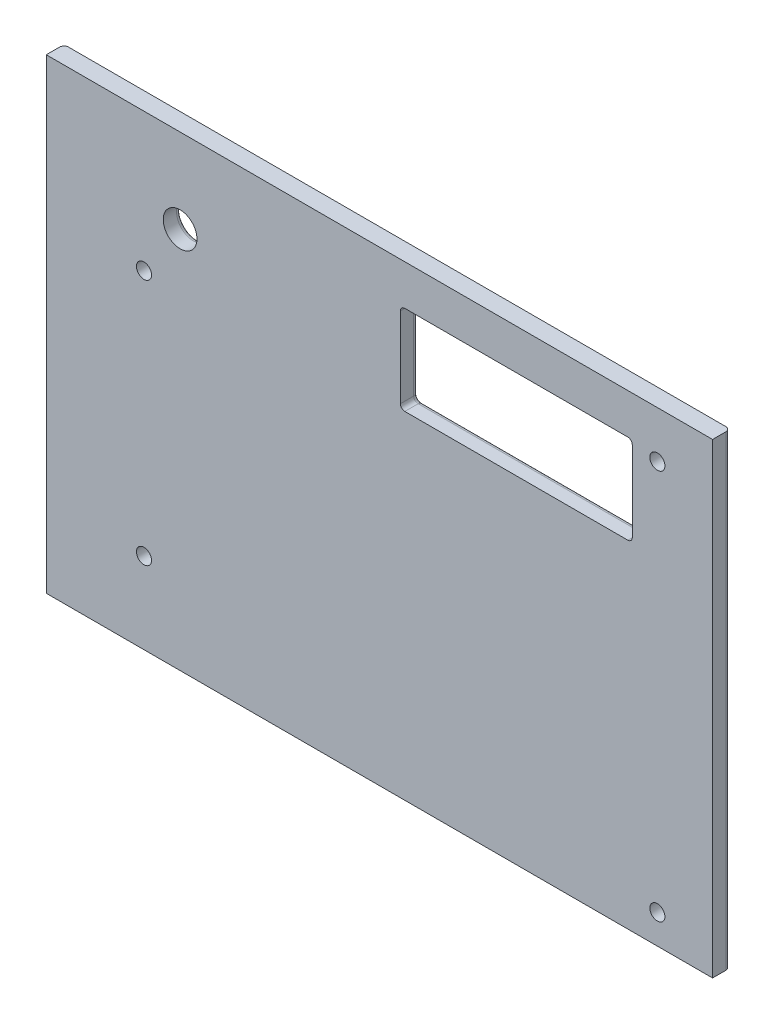
ISO-10303-21;
HEADER;
FILE_DESCRIPTION(('STEP AP214'),'2;1');
FILE_NAME('part.step','',(''),(''),'','','');
FILE_SCHEMA(('AUTOMOTIVE_DESIGN { 1 0 10303 214 1 1 1 1 }'));
ENDSEC;
DATA;
#1=APPLICATION_CONTEXT('core data for automotive mechanical design processes');
#2=APPLICATION_PROTOCOL_DEFINITION('international standard','automotive_design',2000,#1);
#3=PRODUCT_CONTEXT('',#1,'mechanical');
#4=PRODUCT('Part','Part','',(#3));
#5=PRODUCT_RELATED_PRODUCT_CATEGORY('part','',(#4));
#6=PRODUCT_DEFINITION_FORMATION('','',#4);
#7=PRODUCT_DEFINITION_CONTEXT('part definition',#1,'design');
#8=PRODUCT_DEFINITION('design','',#6,#7);
#9=PRODUCT_DEFINITION_SHAPE('','',#8);
#10=(LENGTH_UNIT() NAMED_UNIT(*) SI_UNIT(.MILLI.,.METRE.));
#11=(NAMED_UNIT(*) PLANE_ANGLE_UNIT() SI_UNIT($,.RADIAN.));
#12=(NAMED_UNIT(*) SI_UNIT($,.STERADIAN.) SOLID_ANGLE_UNIT());
#13=UNCERTAINTY_MEASURE_WITH_UNIT(LENGTH_MEASURE(1.E-05),#10,'distance_accuracy_value','');
#14=(GEOMETRIC_REPRESENTATION_CONTEXT(3) GLOBAL_UNCERTAINTY_ASSIGNED_CONTEXT((#13)) GLOBAL_UNIT_ASSIGNED_CONTEXT((#10,
#11,#12)) REPRESENTATION_CONTEXT('',''));
#15=CARTESIAN_POINT('',(0.,0.,0.));
#16=DIRECTION('',(0.,0.,1.));
#17=DIRECTION('',(1.,0.,0.));
#18=AXIS2_PLACEMENT_3D('',#15,#16,#17);
#19=CARTESIAN_POINT('',(0.,0.,-2.));
#20=DIRECTION('',(0.,0.,-1.));
#21=DIRECTION('',(-1.,0.,0.));
#22=AXIS2_PLACEMENT_3D('',#19,#20,#21);
#23=PLANE('',#22);
#24=CARTESIAN_POINT('',(-44.87,33.54,-2.));
#25=DIRECTION('',(0.,0.,-1.));
#26=DIRECTION('',(-1.,0.,0.));
#27=AXIS2_PLACEMENT_3D('',#24,#25,#26);
#28=CIRCLE('',#27,4.8);
#29=CARTESIAN_POINT('',(-49.67,33.54,-2.));
#30=VERTEX_POINT('',#29);
#31=EDGE_CURVE('E251',#30,#30,#28,.F.);
#32=ORIENTED_EDGE('',*,*,#31,.T.);
#33=EDGE_LOOP('',(#32));
#34=FACE_BOUND('',#33,.T.);
#35=DIRECTION('',(1.,0.,0.));
#36=VECTOR('',#35,1.);
#37=CARTESIAN_POINT('',(75.,-52.5,-2.));
#38=LINE('',#37,#36);
#39=CARTESIAN_POINT('',(-74.,-52.5,-2.));
#40=VERTEX_POINT('',#39);
#41=CARTESIAN_POINT('',(74.,-52.5,-2.));
#42=VERTEX_POINT('',#41);
#43=EDGE_CURVE('E308',#40,#42,#38,.T.);
#44=ORIENTED_EDGE('',*,*,#43,.F.);
#45=DIRECTION('',(0.,-1.,0.));
#46=VECTOR('',#45,1.);
#47=CARTESIAN_POINT('',(-74.,52.5,-2.));
#48=LINE('',#47,#46);
#49=CARTESIAN_POINT('',(-74.,52.5,-2.));
#50=VERTEX_POINT('',#49);
#51=EDGE_CURVE('E61',#40,#50,#48,.F.);
#52=ORIENTED_EDGE('',*,*,#51,.T.);
#53=DIRECTION('',(-1.,0.,0.));
#54=VECTOR('',#53,1.);
#55=CARTESIAN_POINT('',(75.,52.5,-2.));
#56=LINE('',#55,#54);
#57=CARTESIAN_POINT('',(74.,52.5,-2.));
#58=VERTEX_POINT('',#57);
#59=EDGE_CURVE('E186',#58,#50,#56,.T.);
#60=ORIENTED_EDGE('',*,*,#59,.F.);
#61=DIRECTION('',(0.,1.,0.));
#62=VECTOR('',#61,1.);
#63=CARTESIAN_POINT('',(74.,-52.5,-2.));
#64=LINE('',#63,#62);
#65=EDGE_CURVE('E297',#58,#42,#64,.F.);
#66=ORIENTED_EDGE('',*,*,#65,.T.);
#67=EDGE_LOOP('',(#44,#52,#60,#66));
#68=FACE_BOUND('',#67,.T.);
#69=CARTESIAN_POINT('',(62.57,41.97,-2.));
#70=DIRECTION('',(0.,0.,1.));
#71=DIRECTION('',(1.,0.,0.));
#72=AXIS2_PLACEMENT_3D('',#69,#70,#71);
#73=CIRCLE('',#72,3.3);
#74=CARTESIAN_POINT('',(65.87,41.97,-2.));
#75=VERTEX_POINT('',#74);
#76=EDGE_CURVE('E447',#75,#75,#73,.T.);
#77=ORIENTED_EDGE('',*,*,#76,.T.);
#78=EDGE_LOOP('',(#77));
#79=FACE_BOUND('',#78,.T.);
#80=CARTESIAN_POINT('',(62.57,-45.91,-2.));
#81=DIRECTION('',(0.,0.,1.));
#82=DIRECTION('',(1.,0.,0.));
#83=AXIS2_PLACEMENT_3D('',#80,#81,#82);
#84=CIRCLE('',#83,3.3);
#85=CARTESIAN_POINT('',(65.87,-45.91,-2.));
#86=VERTEX_POINT('',#85);
#87=EDGE_CURVE('E438',#86,#86,#84,.T.);
#88=ORIENTED_EDGE('',*,*,#87,.T.);
#89=EDGE_LOOP('',(#88));
#90=FACE_BOUND('',#89,.T.);
#91=CARTESIAN_POINT('',(-53.,-34.23,-2.));
#92=DIRECTION('',(0.,0.,1.));
#93=DIRECTION('',(1.,0.,0.));
#94=AXIS2_PLACEMENT_3D('',#91,#92,#93);
#95=CIRCLE('',#94,3.3);
#96=CARTESIAN_POINT('',(-49.7,-34.23,-2.));
#97=VERTEX_POINT('',#96);
#98=EDGE_CURVE('E429',#97,#97,#95,.T.);
#99=ORIENTED_EDGE('',*,*,#98,.T.);
#100=EDGE_LOOP('',(#99));
#101=FACE_BOUND('',#100,.T.);
#102=CARTESIAN_POINT('',(-53.,21.4,-2.));
#103=DIRECTION('',(0.,0.,1.));
#104=DIRECTION('',(1.,0.,0.));
#105=AXIS2_PLACEMENT_3D('',#102,#103,#104);
#106=CIRCLE('',#105,3.3);
#107=CARTESIAN_POINT('',(-49.7,21.4,-2.));
#108=VERTEX_POINT('',#107);
#109=EDGE_CURVE('E413',#108,#108,#106,.T.);
#110=ORIENTED_EDGE('',*,*,#109,.T.);
#111=EDGE_LOOP('',(#110));
#112=FACE_BOUND('',#111,.T.);
#113=CARTESIAN_POINT('',(5.71999999999998,42.42,-2.));
#114=DIRECTION('',(0.,0.,-1.));
#115=DIRECTION('',(-1.,0.,0.));
#116=AXIS2_PLACEMENT_3D('',#113,#114,#115);
#117=CIRCLE('',#116,2.);
#118=CARTESIAN_POINT('',(3.71999999999998,42.42,-2.));
#119=VERTEX_POINT('',#118);
#120=CARTESIAN_POINT('',(5.71999999999998,44.42,-2.));
#121=VERTEX_POINT('',#120);
#122=EDGE_CURVE('E222',#119,#121,#117,.T.);
#123=ORIENTED_EDGE('',*,*,#122,.F.);
#124=DIRECTION('',(0.,1.,0.));
#125=VECTOR('',#124,1.);
#126=CARTESIAN_POINT('',(3.71999999999998,23.32,-2.));
#127=LINE('',#126,#125);
#128=CARTESIAN_POINT('',(3.71999999999998,24.32,-2.));
#129=VERTEX_POINT('',#128);
#130=EDGE_CURVE('E219',#119,#129,#127,.F.);
#131=ORIENTED_EDGE('',*,*,#130,.T.);
#132=CARTESIAN_POINT('',(5.71999999999998,24.32,-2.));
#133=DIRECTION('',(0.,0.,-1.));
#134=DIRECTION('',(-1.,0.,0.));
#135=AXIS2_PLACEMENT_3D('',#132,#133,#134);
#136=CIRCLE('',#135,2.);
#137=CARTESIAN_POINT('',(5.71999999999998,22.32,-2.));
#138=VERTEX_POINT('',#137);
#139=EDGE_CURVE('E216',#138,#129,#136,.T.);
#140=ORIENTED_EDGE('',*,*,#139,.F.);
#141=DIRECTION('',(1.,0.,0.));
#142=VECTOR('',#141,1.);
#143=CARTESIAN_POINT('',(0.,22.32,-2.));
#144=LINE('',#143,#142);
#145=CARTESIAN_POINT('',(55.92,22.32,-2.));
#146=VERTEX_POINT('',#145);
#147=EDGE_CURVE('E214',#138,#146,#144,.T.);
#148=ORIENTED_EDGE('',*,*,#147,.T.);
#149=CARTESIAN_POINT('',(55.92,24.32,-2.));
#150=DIRECTION('',(0.,0.,-1.));
#151=DIRECTION('',(-1.,0.,0.));
#152=AXIS2_PLACEMENT_3D('',#149,#150,#151);
#153=CIRCLE('',#152,2.);
#154=CARTESIAN_POINT('',(57.92,24.32,-2.));
#155=VERTEX_POINT('',#154);
#156=EDGE_CURVE('E211',#155,#146,#153,.T.);
#157=ORIENTED_EDGE('',*,*,#156,.F.);
#158=DIRECTION('',(0.,1.,0.));
#159=VECTOR('',#158,1.);
#160=CARTESIAN_POINT('',(57.92,0.,-2.));
#161=LINE('',#160,#159);
#162=CARTESIAN_POINT('',(57.92,42.42,-2.));
#163=VERTEX_POINT('',#162);
#164=EDGE_CURVE('E207',#155,#163,#161,.T.);
#165=ORIENTED_EDGE('',*,*,#164,.T.);
#166=CARTESIAN_POINT('',(55.92,42.42,-2.));
#167=DIRECTION('',(0.,0.,-1.));
#168=DIRECTION('',(-1.,0.,0.));
#169=AXIS2_PLACEMENT_3D('',#166,#167,#168);
#170=CIRCLE('',#169,2.);
#171=CARTESIAN_POINT('',(55.92,44.42,-2.));
#172=VERTEX_POINT('',#171);
#173=EDGE_CURVE('E204',#172,#163,#170,.T.);
#174=ORIENTED_EDGE('',*,*,#173,.F.);
#175=DIRECTION('',(1.,0.,0.));
#176=VECTOR('',#175,1.);
#177=CARTESIAN_POINT('',(4.71999999999998,44.42,-2.));
#178=LINE('',#177,#176);
#179=EDGE_CURVE('E209',#172,#121,#178,.F.);
#180=ORIENTED_EDGE('',*,*,#179,.T.);
#181=EDGE_LOOP('',(#123,#131,#140,#148,#157,#165,#174,#180));
#182=FACE_BOUND('',#181,.T.);
#183=ADVANCED_FACE('F39',(#34,#68,#79,#90,#101,#112,#182),#23,.T.);
#184=CARTESIAN_POINT('',(0.,0.,2.));
#185=DIRECTION('',(0.,0.,-1.));
#186=DIRECTION('',(-1.,0.,0.));
#187=AXIS2_PLACEMENT_3D('',#184,#185,#186);
#188=PLANE('',#187);
#189=DIRECTION('',(0.,-1.,0.));
#190=VECTOR('',#189,1.);
#191=CARTESIAN_POINT('',(-75.,52.5,2.));
#192=LINE('',#191,#190);
#193=CARTESIAN_POINT('',(-75.,52.5,2.));
#194=VERTEX_POINT('',#193);
#195=CARTESIAN_POINT('',(-75.,-52.5,2.));
#196=VERTEX_POINT('',#195);
#197=EDGE_CURVE('E176',#194,#196,#192,.T.);
#198=ORIENTED_EDGE('',*,*,#197,.T.);
#199=DIRECTION('',(1.,0.,0.));
#200=VECTOR('',#199,1.);
#201=CARTESIAN_POINT('',(75.,-52.5,2.));
#202=LINE('',#201,#200);
#203=CARTESIAN_POINT('',(75.,-52.5,2.));
#204=VERTEX_POINT('',#203);
#205=EDGE_CURVE('E166',#196,#204,#202,.T.);
#206=ORIENTED_EDGE('',*,*,#205,.T.);
#207=DIRECTION('',(0.,1.,0.));
#208=VECTOR('',#207,1.);
#209=CARTESIAN_POINT('',(75.,52.5,2.));
#210=LINE('',#209,#208);
#211=CARTESIAN_POINT('',(75.,52.5,2.));
#212=VERTEX_POINT('',#211);
#213=EDGE_CURVE('E175',#204,#212,#210,.T.);
#214=ORIENTED_EDGE('',*,*,#213,.T.);
#215=DIRECTION('',(-1.,0.,0.));
#216=VECTOR('',#215,1.);
#217=CARTESIAN_POINT('',(75.,52.5,2.));
#218=LINE('',#217,#216);
#219=EDGE_CURVE('E182',#212,#194,#218,.T.);
#220=ORIENTED_EDGE('',*,*,#219,.T.);
#221=EDGE_LOOP('',(#198,#206,#214,#220));
#222=FACE_BOUND('',#221,.T.);
#223=CARTESIAN_POINT('',(62.57,41.97,2.));
#224=DIRECTION('',(0.,0.,1.));
#225=DIRECTION('',(1.,0.,0.));
#226=AXIS2_PLACEMENT_3D('',#223,#224,#225);
#227=CIRCLE('',#226,1.69999999999999);
#228=CARTESIAN_POINT('',(64.27,41.97,2.));
#229=VERTEX_POINT('',#228);
#230=EDGE_CURVE('E315',#229,#229,#227,.T.);
#231=ORIENTED_EDGE('',*,*,#230,.F.);
#232=EDGE_LOOP('',(#231));
#233=FACE_BOUND('',#232,.T.);
#234=CARTESIAN_POINT('',(62.57,-45.91,2.));
#235=DIRECTION('',(0.,0.,1.));
#236=DIRECTION('',(1.,0.,0.));
#237=AXIS2_PLACEMENT_3D('',#234,#235,#236);
#238=CIRCLE('',#237,1.69999999999999);
#239=CARTESIAN_POINT('',(64.27,-45.91,2.));
#240=VERTEX_POINT('',#239);
#241=EDGE_CURVE('E441',#240,#240,#238,.T.);
#242=ORIENTED_EDGE('',*,*,#241,.F.);
#243=EDGE_LOOP('',(#242));
#244=FACE_BOUND('',#243,.T.);
#245=CARTESIAN_POINT('',(-53.,-34.23,2.));
#246=DIRECTION('',(0.,0.,1.));
#247=DIRECTION('',(1.,0.,0.));
#248=AXIS2_PLACEMENT_3D('',#245,#246,#247);
#249=CIRCLE('',#248,1.7);
#250=CARTESIAN_POINT('',(-51.3,-34.23,2.));
#251=VERTEX_POINT('',#250);
#252=EDGE_CURVE('E432',#251,#251,#249,.T.);
#253=ORIENTED_EDGE('',*,*,#252,.F.);
#254=EDGE_LOOP('',(#253));
#255=FACE_BOUND('',#254,.T.);
#256=CARTESIAN_POINT('',(-53.,21.4,2.));
#257=DIRECTION('',(0.,0.,1.));
#258=DIRECTION('',(1.,0.,0.));
#259=AXIS2_PLACEMENT_3D('',#256,#257,#258);
#260=CIRCLE('',#259,1.7);
#261=CARTESIAN_POINT('',(-51.3,21.4,2.));
#262=VERTEX_POINT('',#261);
#263=EDGE_CURVE('E417',#262,#262,#260,.T.);
#264=ORIENTED_EDGE('',*,*,#263,.F.);
#265=EDGE_LOOP('',(#264));
#266=FACE_BOUND('',#265,.T.);
#267=CARTESIAN_POINT('',(-44.87,33.54,2.));
#268=DIRECTION('',(0.,0.,1.));
#269=DIRECTION('',(1.,0.,0.));
#270=AXIS2_PLACEMENT_3D('',#267,#268,#269);
#271=CIRCLE('',#270,3.8);
#272=CARTESIAN_POINT('',(-41.07,33.54,2.));
#273=VERTEX_POINT('',#272);
#274=EDGE_CURVE('E411',#273,#273,#271,.T.);
#275=ORIENTED_EDGE('',*,*,#274,.F.);
#276=EDGE_LOOP('',(#275));
#277=FACE_BOUND('',#276,.T.);
#278=DIRECTION('',(0.,-1.,0.));
#279=VECTOR('',#278,1.);
#280=CARTESIAN_POINT('',(56.92,43.42,2.));
#281=LINE('',#280,#279);
#282=CARTESIAN_POINT('',(56.92,42.42,2.));
#283=VERTEX_POINT('',#282);
#284=CARTESIAN_POINT('',(56.92,24.32,2.));
#285=VERTEX_POINT('',#284);
#286=EDGE_CURVE('E414',#283,#285,#281,.T.);
#287=ORIENTED_EDGE('',*,*,#286,.T.);
#288=CARTESIAN_POINT('',(55.92,24.32,2.));
#289=DIRECTION('',(0.,0.,-1.));
#290=DIRECTION('',(-1.,0.,0.));
#291=AXIS2_PLACEMENT_3D('',#288,#289,#290);
#292=CIRCLE('',#291,1.);
#293=CARTESIAN_POINT('',(55.92,23.32,2.));
#294=VERTEX_POINT('',#293);
#295=EDGE_CURVE('E243',#285,#294,#292,.T.);
#296=ORIENTED_EDGE('',*,*,#295,.T.);
#297=DIRECTION('',(-1.,0.,0.));
#298=VECTOR('',#297,1.);
#299=CARTESIAN_POINT('',(56.92,23.32,2.));
#300=LINE('',#299,#298);
#301=CARTESIAN_POINT('',(5.71999999999998,23.32,2.));
#302=VERTEX_POINT('',#301);
#303=EDGE_CURVE('E286',#294,#302,#300,.T.);
#304=ORIENTED_EDGE('',*,*,#303,.T.);
#305=CARTESIAN_POINT('',(5.71999999999998,24.32,2.));
#306=DIRECTION('',(0.,0.,-1.));
#307=DIRECTION('',(-1.,0.,0.));
#308=AXIS2_PLACEMENT_3D('',#305,#306,#307);
#309=CIRCLE('',#308,1.);
#310=CARTESIAN_POINT('',(4.71999999999998,24.32,2.));
#311=VERTEX_POINT('',#310);
#312=EDGE_CURVE('E245',#302,#311,#309,.T.);
#313=ORIENTED_EDGE('',*,*,#312,.T.);
#314=DIRECTION('',(0.,-1.,0.));
#315=VECTOR('',#314,1.);
#316=CARTESIAN_POINT('',(4.71999999999998,43.42,2.));
#317=LINE('',#316,#315);
#318=CARTESIAN_POINT('',(4.71999999999998,42.42,2.));
#319=VERTEX_POINT('',#318);
#320=EDGE_CURVE('E478',#319,#311,#317,.T.);
#321=ORIENTED_EDGE('',*,*,#320,.F.);
#322=CARTESIAN_POINT('',(5.71999999999998,42.42,2.));
#323=DIRECTION('',(0.,0.,-1.));
#324=DIRECTION('',(-1.,0.,0.));
#325=AXIS2_PLACEMENT_3D('',#322,#323,#324);
#326=CIRCLE('',#325,1.);
#327=CARTESIAN_POINT('',(5.71999999999998,43.42,2.));
#328=VERTEX_POINT('',#327);
#329=EDGE_CURVE('E249',#319,#328,#326,.T.);
#330=ORIENTED_EDGE('',*,*,#329,.T.);
#331=DIRECTION('',(-1.,0.,0.));
#332=VECTOR('',#331,1.);
#333=CARTESIAN_POINT('',(56.92,43.42,2.));
#334=LINE('',#333,#332);
#335=CARTESIAN_POINT('',(55.92,43.42,2.));
#336=VERTEX_POINT('',#335);
#337=EDGE_CURVE('E420',#336,#328,#334,.T.);
#338=ORIENTED_EDGE('',*,*,#337,.F.);
#339=CARTESIAN_POINT('',(55.92,42.42,2.));
#340=DIRECTION('',(0.,0.,-1.));
#341=DIRECTION('',(-1.,0.,0.));
#342=AXIS2_PLACEMENT_3D('',#339,#340,#341);
#343=CIRCLE('',#342,1.);
#344=EDGE_CURVE('E247',#336,#283,#343,.T.);
#345=ORIENTED_EDGE('',*,*,#344,.T.);
#346=EDGE_LOOP('',(#287,#296,#304,#313,#321,#330,#338,#345));
#347=FACE_BOUND('',#346,.T.);
#348=ADVANCED_FACE('F179',(#222,#233,#244,#255,#266,#277,#347),#188,.F.);
#349=CARTESIAN_POINT('',(-75.,52.5,2.));
#350=DIRECTION('',(1.,0.,0.));
#351=DIRECTION('',(0.,1.,0.));
#352=AXIS2_PLACEMENT_3D('',#349,#350,#351);
#353=PLANE('',#352);
#354=DIRECTION('',(0.,0.,-1.));
#355=VECTOR('',#354,1.);
#356=CARTESIAN_POINT('',(-75.,52.5,2.));
#357=LINE('',#356,#355);
#358=CARTESIAN_POINT('',(-75.,52.5,-1.));
#359=VERTEX_POINT('',#358);
#360=EDGE_CURVE('E303',#194,#359,#357,.T.);
#361=ORIENTED_EDGE('',*,*,#360,.T.);
#362=DIRECTION('',(0.,-1.,0.));
#363=VECTOR('',#362,1.);
#364=CARTESIAN_POINT('',(-75.,-52.5,-1.));
#365=LINE('',#364,#363);
#366=CARTESIAN_POINT('',(-75.,-52.5,-1.));
#367=VERTEX_POINT('',#366);
#368=EDGE_CURVE('E191',#359,#367,#365,.T.);
#369=ORIENTED_EDGE('',*,*,#368,.T.);
#370=DIRECTION('',(0.,0.,-1.));
#371=VECTOR('',#370,1.);
#372=CARTESIAN_POINT('',(-75.,-52.5,2.));
#373=LINE('',#372,#371);
#374=EDGE_CURVE('E170',#196,#367,#373,.T.);
#375=ORIENTED_EDGE('',*,*,#374,.F.);
#376=ORIENTED_EDGE('',*,*,#197,.F.);
#377=EDGE_LOOP('',(#361,#369,#375,#376));
#378=FACE_BOUND('',#377,.T.);
#379=ADVANCED_FACE('F189',(#378),#353,.F.);
#380=CARTESIAN_POINT('',(75.,-52.5,2.));
#381=DIRECTION('',(0.,1.,0.));
#382=DIRECTION('',(-1.,0.,0.));
#383=AXIS2_PLACEMENT_3D('',#380,#381,#382);
#384=PLANE('',#383);
#385=ORIENTED_EDGE('',*,*,#374,.T.);
#386=CARTESIAN_POINT('',(-74.,-52.5,-1.));
#387=DIRECTION('',(0.,1.,0.));
#388=DIRECTION('',(-1.,0.,0.));
#389=AXIS2_PLACEMENT_3D('',#386,#387,#388);
#390=CIRCLE('',#389,1.);
#391=EDGE_CURVE('E295',#367,#40,#390,.F.);
#392=ORIENTED_EDGE('',*,*,#391,.T.);
#393=ORIENTED_EDGE('',*,*,#43,.T.);
#394=CARTESIAN_POINT('',(74.,-52.5,-1.));
#395=DIRECTION('',(0.,1.,0.));
#396=DIRECTION('',(-1.,0.,0.));
#397=AXIS2_PLACEMENT_3D('',#394,#395,#396);
#398=CIRCLE('',#397,1.);
#399=CARTESIAN_POINT('',(75.,-52.5,-1.));
#400=VERTEX_POINT('',#399);
#401=EDGE_CURVE('E293',#42,#400,#398,.F.);
#402=ORIENTED_EDGE('',*,*,#401,.T.);
#403=DIRECTION('',(0.,0.,-1.));
#404=VECTOR('',#403,1.);
#405=CARTESIAN_POINT('',(75.,-52.5,2.));
#406=LINE('',#405,#404);
#407=EDGE_CURVE('E172',#204,#400,#406,.T.);
#408=ORIENTED_EDGE('',*,*,#407,.F.);
#409=ORIENTED_EDGE('',*,*,#205,.F.);
#410=EDGE_LOOP('',(#385,#392,#393,#402,#408,#409));
#411=FACE_BOUND('',#410,.T.);
#412=ADVANCED_FACE('F168',(#411),#384,.F.);
#413=CARTESIAN_POINT('',(75.,52.5,2.));
#414=DIRECTION('',(-1.,0.,0.));
#415=DIRECTION('',(0.,-1.,0.));
#416=AXIS2_PLACEMENT_3D('',#413,#414,#415);
#417=PLANE('',#416);
#418=ORIENTED_EDGE('',*,*,#407,.T.);
#419=DIRECTION('',(0.,1.,0.));
#420=VECTOR('',#419,1.);
#421=CARTESIAN_POINT('',(75.,52.5,-1.));
#422=LINE('',#421,#420);
#423=CARTESIAN_POINT('',(75.,52.5,-1.));
#424=VERTEX_POINT('',#423);
#425=EDGE_CURVE('E11',#400,#424,#422,.T.);
#426=ORIENTED_EDGE('',*,*,#425,.T.);
#427=DIRECTION('',(0.,0.,-1.));
#428=VECTOR('',#427,1.);
#429=CARTESIAN_POINT('',(75.,52.5,2.));
#430=LINE('',#429,#428);
#431=EDGE_CURVE('E196',#212,#424,#430,.T.);
#432=ORIENTED_EDGE('',*,*,#431,.F.);
#433=ORIENTED_EDGE('',*,*,#213,.F.);
#434=EDGE_LOOP('',(#418,#426,#432,#433));
#435=FACE_BOUND('',#434,.T.);
#436=ADVANCED_FACE('F322',(#435),#417,.F.);
#437=CARTESIAN_POINT('',(75.,52.5,2.));
#438=DIRECTION('',(0.,-1.,0.));
#439=DIRECTION('',(1.,0.,0.));
#440=AXIS2_PLACEMENT_3D('',#437,#438,#439);
#441=PLANE('',#440);
#442=ORIENTED_EDGE('',*,*,#59,.T.);
#443=CARTESIAN_POINT('',(-74.,52.5,-1.));
#444=DIRECTION('',(0.,-1.,0.));
#445=DIRECTION('',(1.,0.,0.));
#446=AXIS2_PLACEMENT_3D('',#443,#444,#445);
#447=CIRCLE('',#446,1.);
#448=EDGE_CURVE('E47',#50,#359,#447,.F.);
#449=ORIENTED_EDGE('',*,*,#448,.T.);
#450=ORIENTED_EDGE('',*,*,#360,.F.);
#451=ORIENTED_EDGE('',*,*,#219,.F.);
#452=ORIENTED_EDGE('',*,*,#431,.T.);
#453=CARTESIAN_POINT('',(74.,52.5,-1.));
#454=DIRECTION('',(0.,-1.,0.));
#455=DIRECTION('',(1.,0.,0.));
#456=AXIS2_PLACEMENT_3D('',#453,#454,#455);
#457=CIRCLE('',#456,1.);
#458=EDGE_CURVE('E54',#424,#58,#457,.F.);
#459=ORIENTED_EDGE('',*,*,#458,.T.);
#460=EDGE_LOOP('',(#442,#449,#450,#451,#452,#459));
#461=FACE_BOUND('',#460,.T.);
#462=ADVANCED_FACE('F302',(#461),#441,.F.);
#463=CARTESIAN_POINT('',(62.57,41.97,-0.399999999999999));
#464=DIRECTION('',(0.,0.,-1.));
#465=DIRECTION('',(-1.,0.,0.));
#466=AXIS2_PLACEMENT_3D('',#463,#464,#465);
#467=CONICAL_SURFACE('',#466,1.69999999999999,0.785398163397449);
#468=ORIENTED_EDGE('',*,*,#76,.F.);
#469=EDGE_LOOP('',(#468));
#470=FACE_BOUND('',#469,.T.);
#471=CARTESIAN_POINT('',(62.57,41.97,-0.399999999999999));
#472=DIRECTION('',(0.,0.,1.));
#473=DIRECTION('',(1.,0.,0.));
#474=AXIS2_PLACEMENT_3D('',#471,#472,#473);
#475=CIRCLE('',#474,1.69999999999999);
#476=CARTESIAN_POINT('',(64.27,41.97,-0.399999999999999));
#477=VERTEX_POINT('',#476);
#478=EDGE_CURVE('E311',#477,#477,#475,.T.);
#479=ORIENTED_EDGE('',*,*,#478,.T.);
#480=EDGE_LOOP('',(#479));
#481=FACE_BOUND('',#480,.T.);
#482=ADVANCED_FACE('F341',(#470,#481),#467,.F.);
#483=CARTESIAN_POINT('',(62.57,41.97,2.));
#484=DIRECTION('',(0.,0.,1.));
#485=DIRECTION('',(1.,0.,0.));
#486=AXIS2_PLACEMENT_3D('',#483,#484,#485);
#487=CYLINDRICAL_SURFACE('',#486,1.69999999999999);
#488=ORIENTED_EDGE('',*,*,#478,.F.);
#489=EDGE_LOOP('',(#488));
#490=FACE_BOUND('',#489,.T.);
#491=ORIENTED_EDGE('',*,*,#230,.T.);
#492=EDGE_LOOP('',(#491));
#493=FACE_BOUND('',#492,.T.);
#494=ADVANCED_FACE('F453',(#490,#493),#487,.F.);
#495=CARTESIAN_POINT('',(62.57,-45.91,-0.399999999999999));
#496=DIRECTION('',(0.,0.,-1.));
#497=DIRECTION('',(-1.,0.,0.));
#498=AXIS2_PLACEMENT_3D('',#495,#496,#497);
#499=CONICAL_SURFACE('',#498,1.69999999999999,0.785398163397449);
#500=ORIENTED_EDGE('',*,*,#87,.F.);
#501=EDGE_LOOP('',(#500));
#502=FACE_BOUND('',#501,.T.);
#503=CARTESIAN_POINT('',(62.57,-45.91,-0.399999999999999));
#504=DIRECTION('',(0.,0.,1.));
#505=DIRECTION('',(1.,0.,0.));
#506=AXIS2_PLACEMENT_3D('',#503,#504,#505);
#507=CIRCLE('',#506,1.69999999999999);
#508=CARTESIAN_POINT('',(64.27,-45.91,-0.399999999999999));
#509=VERTEX_POINT('',#508);
#510=EDGE_CURVE('E444',#509,#509,#507,.T.);
#511=ORIENTED_EDGE('',*,*,#510,.T.);
#512=EDGE_LOOP('',(#511));
#513=FACE_BOUND('',#512,.T.);
#514=ADVANCED_FACE('F530',(#502,#513),#499,.F.);
#515=CARTESIAN_POINT('',(62.57,-45.91,2.));
#516=DIRECTION('',(0.,0.,1.));
#517=DIRECTION('',(1.,0.,0.));
#518=AXIS2_PLACEMENT_3D('',#515,#516,#517);
#519=CYLINDRICAL_SURFACE('',#518,1.69999999999999);
#520=ORIENTED_EDGE('',*,*,#510,.F.);
#521=EDGE_LOOP('',(#520));
#522=FACE_BOUND('',#521,.T.);
#523=ORIENTED_EDGE('',*,*,#241,.T.);
#524=EDGE_LOOP('',(#523));
#525=FACE_BOUND('',#524,.T.);
#526=ADVANCED_FACE('F526',(#522,#525),#519,.F.);
#527=CARTESIAN_POINT('',(-53.,-34.23,-0.399999999999999));
#528=DIRECTION('',(0.,0.,-1.));
#529=DIRECTION('',(-1.,0.,0.));
#530=AXIS2_PLACEMENT_3D('',#527,#528,#529);
#531=CONICAL_SURFACE('',#530,1.7,0.785398163397447);
#532=ORIENTED_EDGE('',*,*,#98,.F.);
#533=EDGE_LOOP('',(#532));
#534=FACE_BOUND('',#533,.T.);
#535=CARTESIAN_POINT('',(-53.,-34.23,-0.399999999999999));
#536=DIRECTION('',(0.,0.,1.));
#537=DIRECTION('',(1.,0.,0.));
#538=AXIS2_PLACEMENT_3D('',#535,#536,#537);
#539=CIRCLE('',#538,1.7);
#540=CARTESIAN_POINT('',(-51.3,-34.23,-0.399999999999999));
#541=VERTEX_POINT('',#540);
#542=EDGE_CURVE('E435',#541,#541,#539,.T.);
#543=ORIENTED_EDGE('',*,*,#542,.T.);
#544=EDGE_LOOP('',(#543));
#545=FACE_BOUND('',#544,.T.);
#546=ADVANCED_FACE('F522',(#534,#545),#531,.F.);
#547=CARTESIAN_POINT('',(-53.,-34.23,2.));
#548=DIRECTION('',(0.,0.,1.));
#549=DIRECTION('',(1.,0.,0.));
#550=AXIS2_PLACEMENT_3D('',#547,#548,#549);
#551=CYLINDRICAL_SURFACE('',#550,1.7);
#552=ORIENTED_EDGE('',*,*,#542,.F.);
#553=EDGE_LOOP('',(#552));
#554=FACE_BOUND('',#553,.T.);
#555=ORIENTED_EDGE('',*,*,#252,.T.);
#556=EDGE_LOOP('',(#555));
#557=FACE_BOUND('',#556,.T.);
#558=ADVANCED_FACE('F518',(#554,#557),#551,.F.);
#559=CARTESIAN_POINT('',(-53.,21.4,-0.399999999999999));
#560=DIRECTION('',(0.,0.,-1.));
#561=DIRECTION('',(-1.,0.,0.));
#562=AXIS2_PLACEMENT_3D('',#559,#560,#561);
#563=CONICAL_SURFACE('',#562,1.7,0.785398163397447);
#564=ORIENTED_EDGE('',*,*,#109,.F.);
#565=EDGE_LOOP('',(#564));
#566=FACE_BOUND('',#565,.T.);
#567=CARTESIAN_POINT('',(-53.,21.4,-0.399999999999999));
#568=DIRECTION('',(0.,0.,1.));
#569=DIRECTION('',(1.,0.,0.));
#570=AXIS2_PLACEMENT_3D('',#567,#568,#569);
#571=CIRCLE('',#570,1.7);
#572=CARTESIAN_POINT('',(-51.3,21.4,-0.399999999999999));
#573=VERTEX_POINT('',#572);
#574=EDGE_CURVE('E426',#573,#573,#571,.T.);
#575=ORIENTED_EDGE('',*,*,#574,.T.);
#576=EDGE_LOOP('',(#575));
#577=FACE_BOUND('',#576,.T.);
#578=ADVANCED_FACE('F514',(#566,#577),#563,.F.);
#579=CARTESIAN_POINT('',(-53.,21.4,2.));
#580=DIRECTION('',(0.,0.,1.));
#581=DIRECTION('',(1.,0.,0.));
#582=AXIS2_PLACEMENT_3D('',#579,#580,#581);
#583=CYLINDRICAL_SURFACE('',#582,1.7);
#584=ORIENTED_EDGE('',*,*,#574,.F.);
#585=EDGE_LOOP('',(#584));
#586=FACE_BOUND('',#585,.T.);
#587=ORIENTED_EDGE('',*,*,#263,.T.);
#588=EDGE_LOOP('',(#587));
#589=FACE_BOUND('',#588,.T.);
#590=ADVANCED_FACE('F407',(#586,#589),#583,.F.);
#591=CARTESIAN_POINT('',(-44.87,33.54,2.));
#592=DIRECTION('',(0.,0.,1.));
#593=DIRECTION('',(1.,0.,0.));
#594=AXIS2_PLACEMENT_3D('',#591,#592,#593);
#595=CYLINDRICAL_SURFACE('',#594,3.8);
#596=CARTESIAN_POINT('',(-44.87,33.54,-1.));
#597=DIRECTION('',(0.,0.,-1.));
#598=DIRECTION('',(-1.,0.,0.));
#599=AXIS2_PLACEMENT_3D('',#596,#597,#598);
#600=CIRCLE('',#599,3.8);
#601=CARTESIAN_POINT('',(-48.67,33.54,-1.));
#602=VERTEX_POINT('',#601);
#603=EDGE_CURVE('E289',#602,#602,#600,.T.);
#604=ORIENTED_EDGE('',*,*,#603,.T.);
#605=EDGE_LOOP('',(#604));
#606=FACE_BOUND('',#605,.T.);
#607=ORIENTED_EDGE('',*,*,#274,.T.);
#608=EDGE_LOOP('',(#607));
#609=FACE_BOUND('',#608,.T.);
#610=ADVANCED_FACE('F403',(#606,#609),#595,.F.);
#611=CARTESIAN_POINT('',(56.92,23.32,-8.));
#612=DIRECTION('',(0.,1.,0.));
#613=DIRECTION('',(-1.,0.,0.));
#614=AXIS2_PLACEMENT_3D('',#611,#612,#613);
#615=PLANE('',#614);
#616=ORIENTED_EDGE('',*,*,#303,.F.);
#617=DIRECTION('',(0.,0.,1.));
#618=VECTOR('',#617,1.);
#619=CARTESIAN_POINT('',(55.92,23.32,-2.));
#620=LINE('',#619,#618);
#621=CARTESIAN_POINT('',(55.92,23.32,-1.));
#622=VERTEX_POINT('',#621);
#623=EDGE_CURVE('E229',#294,#622,#620,.F.);
#624=ORIENTED_EDGE('',*,*,#623,.T.);
#625=DIRECTION('',(1.,0.,0.));
#626=VECTOR('',#625,1.);
#627=CARTESIAN_POINT('',(56.92,23.32,-1.));
#628=LINE('',#627,#626);
#629=CARTESIAN_POINT('',(5.71999999999998,23.32,-1.));
#630=VERTEX_POINT('',#629);
#631=EDGE_CURVE('E227',#622,#630,#628,.F.);
#632=ORIENTED_EDGE('',*,*,#631,.T.);
#633=DIRECTION('',(0.,0.,1.));
#634=VECTOR('',#633,1.);
#635=CARTESIAN_POINT('',(5.71999999999998,23.32,-8.));
#636=LINE('',#635,#634);
#637=EDGE_CURVE('E225',#630,#302,#636,.T.);
#638=ORIENTED_EDGE('',*,*,#637,.T.);
#639=EDGE_LOOP('',(#616,#624,#632,#638));
#640=FACE_BOUND('',#639,.T.);
#641=ADVANCED_FACE('F406',(#640),#615,.T.);
#642=CARTESIAN_POINT('',(4.71999999999998,43.42,-8.));
#643=DIRECTION('',(-1.,0.,0.));
#644=DIRECTION('',(0.,0.,1.));
#645=AXIS2_PLACEMENT_3D('',#642,#643,#644);
#646=PLANE('',#645);
#647=ORIENTED_EDGE('',*,*,#320,.T.);
#648=DIRECTION('',(0.,0.,1.));
#649=VECTOR('',#648,1.);
#650=CARTESIAN_POINT('',(4.71999999999998,24.32,-8.));
#651=LINE('',#650,#649);
#652=CARTESIAN_POINT('',(4.71999999999998,24.32,-1.));
#653=VERTEX_POINT('',#652);
#654=EDGE_CURVE('E202',#311,#653,#651,.F.);
#655=ORIENTED_EDGE('',*,*,#654,.T.);
#656=DIRECTION('',(0.,1.,0.));
#657=VECTOR('',#656,1.);
#658=CARTESIAN_POINT('',(4.71999999999998,43.42,-1.));
#659=LINE('',#658,#657);
#660=CARTESIAN_POINT('',(4.71999999999998,42.42,-1.));
#661=VERTEX_POINT('',#660);
#662=EDGE_CURVE('E194',#653,#661,#659,.T.);
#663=ORIENTED_EDGE('',*,*,#662,.T.);
#664=DIRECTION('',(0.,0.,1.));
#665=VECTOR('',#664,1.);
#666=CARTESIAN_POINT('',(4.71999999999998,42.42,2.));
#667=LINE('',#666,#665);
#668=EDGE_CURVE('E192',#661,#319,#667,.T.);
#669=ORIENTED_EDGE('',*,*,#668,.T.);
#670=EDGE_LOOP('',(#647,#655,#663,#669));
#671=FACE_BOUND('',#670,.T.);
#672=ADVANCED_FACE('F504',(#671),#646,.F.);
#673=CARTESIAN_POINT('',(56.92,43.42,-8.));
#674=DIRECTION('',(0.,1.,0.));
#675=DIRECTION('',(-1.,0.,0.));
#676=AXIS2_PLACEMENT_3D('',#673,#674,#675);
#677=PLANE('',#676);
#678=DIRECTION('',(1.,0.,0.));
#679=VECTOR('',#678,1.);
#680=CARTESIAN_POINT('',(56.92,43.42,-1.));
#681=LINE('',#680,#679);
#682=CARTESIAN_POINT('',(5.71999999999998,43.42,-1.));
#683=VERTEX_POINT('',#682);
#684=CARTESIAN_POINT('',(55.92,43.42,-1.));
#685=VERTEX_POINT('',#684);
#686=EDGE_CURVE('E233',#683,#685,#681,.T.);
#687=ORIENTED_EDGE('',*,*,#686,.T.);
#688=DIRECTION('',(0.,0.,1.));
#689=VECTOR('',#688,1.);
#690=CARTESIAN_POINT('',(55.92,43.42,-8.));
#691=LINE('',#690,#689);
#692=EDGE_CURVE('E235',#685,#336,#691,.T.);
#693=ORIENTED_EDGE('',*,*,#692,.T.);
#694=ORIENTED_EDGE('',*,*,#337,.T.);
#695=DIRECTION('',(0.,0.,1.));
#696=VECTOR('',#695,1.);
#697=CARTESIAN_POINT('',(5.71999999999998,43.42,-2.));
#698=LINE('',#697,#696);
#699=EDGE_CURVE('E231',#328,#683,#698,.F.);
#700=ORIENTED_EDGE('',*,*,#699,.T.);
#701=EDGE_LOOP('',(#687,#693,#694,#700));
#702=FACE_BOUND('',#701,.T.);
#703=ADVANCED_FACE('F485',(#702),#677,.F.);
#704=CARTESIAN_POINT('',(56.92,43.42,-8.));
#705=DIRECTION('',(-1.,0.,0.));
#706=DIRECTION('',(0.,0.,1.));
#707=AXIS2_PLACEMENT_3D('',#704,#705,#706);
#708=PLANE('',#707);
#709=DIRECTION('',(0.,1.,0.));
#710=VECTOR('',#709,1.);
#711=CARTESIAN_POINT('',(56.92,43.42,-1.));
#712=LINE('',#711,#710);
#713=CARTESIAN_POINT('',(56.92,42.42,-1.));
#714=VERTEX_POINT('',#713);
#715=CARTESIAN_POINT('',(56.92,24.32,-1.));
#716=VERTEX_POINT('',#715);
#717=EDGE_CURVE('E239',#714,#716,#712,.F.);
#718=ORIENTED_EDGE('',*,*,#717,.T.);
#719=DIRECTION('',(0.,0.,1.));
#720=VECTOR('',#719,1.);
#721=CARTESIAN_POINT('',(56.92,24.32,2.));
#722=LINE('',#721,#720);
#723=EDGE_CURVE('E241',#716,#285,#722,.T.);
#724=ORIENTED_EDGE('',*,*,#723,.T.);
#725=ORIENTED_EDGE('',*,*,#286,.F.);
#726=DIRECTION('',(0.,0.,1.));
#727=VECTOR('',#726,1.);
#728=CARTESIAN_POINT('',(56.92,42.42,-8.));
#729=LINE('',#728,#727);
#730=EDGE_CURVE('E237',#283,#714,#729,.F.);
#731=ORIENTED_EDGE('',*,*,#730,.T.);
#732=EDGE_LOOP('',(#718,#724,#725,#731));
#733=FACE_BOUND('',#732,.T.);
#734=ADVANCED_FACE('F394',(#733),#708,.T.);
#735=CARTESIAN_POINT('',(55.92,24.32,-8.));
#736=DIRECTION('',(0.,0.,-1.));
#737=DIRECTION('',(-1.,0.,0.));
#738=AXIS2_PLACEMENT_3D('',#735,#736,#737);
#739=CYLINDRICAL_SURFACE('',#738,1.);
#740=ORIENTED_EDGE('',*,*,#295,.F.);
#741=ORIENTED_EDGE('',*,*,#723,.F.);
#742=CARTESIAN_POINT('',(55.92,24.32,-1.));
#743=DIRECTION('',(0.,0.,-1.));
#744=DIRECTION('',(-1.,0.,0.));
#745=AXIS2_PLACEMENT_3D('',#742,#743,#744);
#746=CIRCLE('',#745,1.);
#747=EDGE_CURVE('E280',#622,#716,#746,.F.);
#748=ORIENTED_EDGE('',*,*,#747,.F.);
#749=ORIENTED_EDGE('',*,*,#623,.F.);
#750=EDGE_LOOP('',(#740,#741,#748,#749));
#751=FACE_BOUND('',#750,.T.);
#752=ADVANCED_FACE('F390',(#751),#739,.F.);
#753=CARTESIAN_POINT('',(55.92,42.42,-8.));
#754=DIRECTION('',(0.,0.,1.));
#755=DIRECTION('',(1.,0.,0.));
#756=AXIS2_PLACEMENT_3D('',#753,#754,#755);
#757=CYLINDRICAL_SURFACE('',#756,1.);
#758=ORIENTED_EDGE('',*,*,#344,.F.);
#759=ORIENTED_EDGE('',*,*,#692,.F.);
#760=CARTESIAN_POINT('',(55.92,42.42,-1.));
#761=DIRECTION('',(0.,0.,-1.));
#762=DIRECTION('',(-1.,0.,0.));
#763=AXIS2_PLACEMENT_3D('',#760,#761,#762);
#764=CIRCLE('',#763,1.);
#765=EDGE_CURVE('E277',#714,#685,#764,.F.);
#766=ORIENTED_EDGE('',*,*,#765,.F.);
#767=ORIENTED_EDGE('',*,*,#730,.F.);
#768=EDGE_LOOP('',(#758,#759,#766,#767));
#769=FACE_BOUND('',#768,.T.);
#770=ADVANCED_FACE('F386',(#769),#757,.F.);
#771=CARTESIAN_POINT('',(57.92,0.,-1.));
#772=DIRECTION('',(0.,1.,0.));
#773=DIRECTION('',(0.,0.,1.));
#774=AXIS2_PLACEMENT_3D('',#771,#772,#773);
#775=CYLINDRICAL_SURFACE('',#774,1.);
#776=CARTESIAN_POINT('',(57.92,42.42,-1.));
#777=DIRECTION('',(0.,1.,0.));
#778=DIRECTION('',(0.,0.,1.));
#779=AXIS2_PLACEMENT_3D('',#776,#777,#778);
#780=CIRCLE('',#779,1.);
#781=EDGE_CURVE('E274',#163,#714,#780,.T.);
#782=ORIENTED_EDGE('',*,*,#781,.F.);
#783=ORIENTED_EDGE('',*,*,#164,.F.);
#784=CARTESIAN_POINT('',(57.92,24.32,-1.));
#785=DIRECTION('',(0.,-1.,0.));
#786=DIRECTION('',(0.,0.,-1.));
#787=AXIS2_PLACEMENT_3D('',#784,#785,#786);
#788=CIRCLE('',#787,1.);
#789=EDGE_CURVE('E283',#716,#155,#788,.T.);
#790=ORIENTED_EDGE('',*,*,#789,.F.);
#791=ORIENTED_EDGE('',*,*,#717,.F.);
#792=EDGE_LOOP('',(#782,#783,#790,#791));
#793=FACE_BOUND('',#792,.T.);
#794=ADVANCED_FACE('F382',(#793),#775,.T.);
#795=CARTESIAN_POINT('',(55.92,24.32,-1.));
#796=DIRECTION('',(0.,0.,-1.));
#797=DIRECTION('',(-1.,0.,0.));
#798=AXIS2_PLACEMENT_3D('',#795,#796,#797);
#799=TOROIDAL_SURFACE('',#798,2.,1.);
#800=ORIENTED_EDGE('',*,*,#789,.T.);
#801=ORIENTED_EDGE('',*,*,#156,.T.);
#802=CARTESIAN_POINT('',(55.92,22.32,-1.));
#803=DIRECTION('',(1.,0.,0.));
#804=DIRECTION('',(0.,0.,-1.));
#805=AXIS2_PLACEMENT_3D('',#802,#803,#804);
#806=CIRCLE('',#805,1.);
#807=EDGE_CURVE('E271',#622,#146,#806,.F.);
#808=ORIENTED_EDGE('',*,*,#807,.F.);
#809=ORIENTED_EDGE('',*,*,#747,.T.);
#810=EDGE_LOOP('',(#800,#801,#808,#809));
#811=FACE_BOUND('',#810,.T.);
#812=ADVANCED_FACE('F378',(#811),#799,.T.);
#813=CARTESIAN_POINT('',(55.92,42.42,-1.));
#814=DIRECTION('',(0.,0.,-1.));
#815=DIRECTION('',(-1.,0.,0.));
#816=AXIS2_PLACEMENT_3D('',#813,#814,#815);
#817=TOROIDAL_SURFACE('',#816,2.,1.);
#818=ORIENTED_EDGE('',*,*,#781,.T.);
#819=ORIENTED_EDGE('',*,*,#765,.T.);
#820=CARTESIAN_POINT('',(55.92,44.42,-1.));
#821=DIRECTION('',(1.,0.,0.));
#822=DIRECTION('',(0.,0.,-1.));
#823=AXIS2_PLACEMENT_3D('',#820,#821,#822);
#824=CIRCLE('',#823,1.);
#825=EDGE_CURVE('E268',#172,#685,#824,.F.);
#826=ORIENTED_EDGE('',*,*,#825,.F.);
#827=ORIENTED_EDGE('',*,*,#173,.T.);
#828=EDGE_LOOP('',(#818,#819,#826,#827));
#829=FACE_BOUND('',#828,.T.);
#830=ADVANCED_FACE('F374',(#829),#817,.T.);
#831=CARTESIAN_POINT('',(0.,22.32,-1.));
#832=DIRECTION('',(1.,0.,0.));
#833=DIRECTION('',(0.,1.,0.));
#834=AXIS2_PLACEMENT_3D('',#831,#832,#833);
#835=CYLINDRICAL_SURFACE('',#834,1.);
#836=ORIENTED_EDGE('',*,*,#807,.T.);
#837=ORIENTED_EDGE('',*,*,#147,.F.);
#838=CARTESIAN_POINT('',(5.71999999999998,22.32,-1.));
#839=DIRECTION('',(-1.,0.,0.));
#840=DIRECTION('',(0.,0.,1.));
#841=AXIS2_PLACEMENT_3D('',#838,#839,#840);
#842=CIRCLE('',#841,1.);
#843=EDGE_CURVE('E265',#630,#138,#842,.T.);
#844=ORIENTED_EDGE('',*,*,#843,.F.);
#845=ORIENTED_EDGE('',*,*,#631,.F.);
#846=EDGE_LOOP('',(#836,#837,#844,#845));
#847=FACE_BOUND('',#846,.T.);
#848=ADVANCED_FACE('F370',(#847),#835,.T.);
#849=CARTESIAN_POINT('',(5.71999999999998,24.32,-8.));
#850=DIRECTION('',(0.,0.,1.));
#851=DIRECTION('',(1.,0.,0.));
#852=AXIS2_PLACEMENT_3D('',#849,#850,#851);
#853=CYLINDRICAL_SURFACE('',#852,1.);
#854=ORIENTED_EDGE('',*,*,#312,.F.);
#855=ORIENTED_EDGE('',*,*,#637,.F.);
#856=CARTESIAN_POINT('',(5.71999999999998,24.32,-1.));
#857=DIRECTION('',(0.,0.,-1.));
#858=DIRECTION('',(-1.,0.,0.));
#859=AXIS2_PLACEMENT_3D('',#856,#857,#858);
#860=CIRCLE('',#859,1.);
#861=EDGE_CURVE('E262',#653,#630,#860,.F.);
#862=ORIENTED_EDGE('',*,*,#861,.F.);
#863=ORIENTED_EDGE('',*,*,#654,.F.);
#864=EDGE_LOOP('',(#854,#855,#862,#863));
#865=FACE_BOUND('',#864,.T.);
#866=ADVANCED_FACE('F366',(#865),#853,.F.);
#867=CARTESIAN_POINT('',(5.71999999999998,42.42,-8.));
#868=DIRECTION('',(0.,0.,-1.));
#869=DIRECTION('',(-1.,0.,0.));
#870=AXIS2_PLACEMENT_3D('',#867,#868,#869);
#871=CYLINDRICAL_SURFACE('',#870,1.);
#872=ORIENTED_EDGE('',*,*,#329,.F.);
#873=ORIENTED_EDGE('',*,*,#668,.F.);
#874=CARTESIAN_POINT('',(5.71999999999998,42.42,-1.));
#875=DIRECTION('',(0.,0.,-1.));
#876=DIRECTION('',(-1.,0.,0.));
#877=AXIS2_PLACEMENT_3D('',#874,#875,#876);
#878=CIRCLE('',#877,1.);
#879=EDGE_CURVE('E259',#683,#661,#878,.F.);
#880=ORIENTED_EDGE('',*,*,#879,.F.);
#881=ORIENTED_EDGE('',*,*,#699,.F.);
#882=EDGE_LOOP('',(#872,#873,#880,#881));
#883=FACE_BOUND('',#882,.T.);
#884=ADVANCED_FACE('F362',(#883),#871,.F.);
#885=CARTESIAN_POINT('',(56.92,44.42,-1.));
#886=DIRECTION('',(-1.,0.,0.));
#887=DIRECTION('',(0.,-1.,0.));
#888=AXIS2_PLACEMENT_3D('',#885,#886,#887);
#889=CYLINDRICAL_SURFACE('',#888,1.);
#890=ORIENTED_EDGE('',*,*,#825,.T.);
#891=ORIENTED_EDGE('',*,*,#686,.F.);
#892=CARTESIAN_POINT('',(5.71999999999998,44.42,-1.));
#893=DIRECTION('',(-1.,0.,0.));
#894=DIRECTION('',(0.,0.,1.));
#895=AXIS2_PLACEMENT_3D('',#892,#893,#894);
#896=CIRCLE('',#895,1.);
#897=EDGE_CURVE('E256',#121,#683,#896,.T.);
#898=ORIENTED_EDGE('',*,*,#897,.F.);
#899=ORIENTED_EDGE('',*,*,#179,.F.);
#900=EDGE_LOOP('',(#890,#891,#898,#899));
#901=FACE_BOUND('',#900,.T.);
#902=ADVANCED_FACE('F358',(#901),#889,.T.);
#903=CARTESIAN_POINT('',(5.71999999999998,24.32,-1.));
#904=DIRECTION('',(0.,0.,-1.));
#905=DIRECTION('',(-1.,0.,0.));
#906=AXIS2_PLACEMENT_3D('',#903,#904,#905);
#907=TOROIDAL_SURFACE('',#906,2.,1.);
#908=ORIENTED_EDGE('',*,*,#843,.T.);
#909=ORIENTED_EDGE('',*,*,#139,.T.);
#910=CARTESIAN_POINT('',(3.71999999999998,24.32,-1.));
#911=DIRECTION('',(0.,-1.,0.));
#912=DIRECTION('',(0.,0.,-1.));
#913=AXIS2_PLACEMENT_3D('',#910,#911,#912);
#914=CIRCLE('',#913,1.);
#915=EDGE_CURVE('E254',#653,#129,#914,.F.);
#916=ORIENTED_EDGE('',*,*,#915,.F.);
#917=ORIENTED_EDGE('',*,*,#861,.T.);
#918=EDGE_LOOP('',(#908,#909,#916,#917));
#919=FACE_BOUND('',#918,.T.);
#920=ADVANCED_FACE('F354',(#919),#907,.T.);
#921=CARTESIAN_POINT('',(5.71999999999998,42.42,-1.));
#922=DIRECTION('',(0.,0.,-1.));
#923=DIRECTION('',(-1.,0.,0.));
#924=AXIS2_PLACEMENT_3D('',#921,#922,#923);
#925=TOROIDAL_SURFACE('',#924,2.,1.);
#926=ORIENTED_EDGE('',*,*,#897,.T.);
#927=ORIENTED_EDGE('',*,*,#879,.T.);
#928=CARTESIAN_POINT('',(3.71999999999998,42.42,-1.));
#929=DIRECTION('',(0.,1.,0.));
#930=DIRECTION('',(0.,0.,1.));
#931=AXIS2_PLACEMENT_3D('',#928,#929,#930);
#932=CIRCLE('',#931,1.);
#933=EDGE_CURVE('E252',#119,#661,#932,.F.);
#934=ORIENTED_EDGE('',*,*,#933,.F.);
#935=ORIENTED_EDGE('',*,*,#122,.T.);
#936=EDGE_LOOP('',(#926,#927,#934,#935));
#937=FACE_BOUND('',#936,.T.);
#938=ADVANCED_FACE('F350',(#937),#925,.T.);
#939=CARTESIAN_POINT('',(3.71999999999998,43.42,-1.));
#940=DIRECTION('',(0.,-1.,0.));
#941=DIRECTION('',(0.,0.,-1.));
#942=AXIS2_PLACEMENT_3D('',#939,#940,#941);
#943=CYLINDRICAL_SURFACE('',#942,1.);
#944=ORIENTED_EDGE('',*,*,#915,.T.);
#945=ORIENTED_EDGE('',*,*,#130,.F.);
#946=ORIENTED_EDGE('',*,*,#933,.T.);
#947=ORIENTED_EDGE('',*,*,#662,.F.);
#948=EDGE_LOOP('',(#944,#945,#946,#947));
#949=FACE_BOUND('',#948,.T.);
#950=ADVANCED_FACE('F347',(#949),#943,.T.);
#951=CARTESIAN_POINT('',(-44.87,33.54,-1.));
#952=DIRECTION('',(0.,0.,-1.));
#953=DIRECTION('',(-1.,0.,0.));
#954=AXIS2_PLACEMENT_3D('',#951,#952,#953);
#955=TOROIDAL_SURFACE('',#954,4.8,1.);
#956=ORIENTED_EDGE('',*,*,#603,.F.);
#957=EDGE_LOOP('',(#956));
#958=FACE_BOUND('',#957,.T.);
#959=ORIENTED_EDGE('',*,*,#31,.F.);
#960=EDGE_LOOP('',(#959));
#961=FACE_BOUND('',#960,.T.);
#962=ADVANCED_FACE('F327',(#958,#961),#955,.T.);
#963=CARTESIAN_POINT('',(-74.,52.5,-1.));
#964=DIRECTION('',(0.,1.,0.));
#965=DIRECTION('',(-1.,0.,0.));
#966=AXIS2_PLACEMENT_3D('',#963,#964,#965);
#967=CYLINDRICAL_SURFACE('',#966,1.);
#968=ORIENTED_EDGE('',*,*,#448,.F.);
#969=ORIENTED_EDGE('',*,*,#51,.F.);
#970=ORIENTED_EDGE('',*,*,#391,.F.);
#971=ORIENTED_EDGE('',*,*,#368,.F.);
#972=EDGE_LOOP('',(#968,#969,#970,#971));
#973=FACE_BOUND('',#972,.T.);
#974=ADVANCED_FACE('F306',(#973),#967,.T.);
#975=CARTESIAN_POINT('',(74.,52.5,-1.));
#976=DIRECTION('',(0.,-1.,0.));
#977=DIRECTION('',(1.,0.,0.));
#978=AXIS2_PLACEMENT_3D('',#975,#976,#977);
#979=CYLINDRICAL_SURFACE('',#978,1.);
#980=ORIENTED_EDGE('',*,*,#401,.F.);
#981=ORIENTED_EDGE('',*,*,#65,.F.);
#982=ORIENTED_EDGE('',*,*,#458,.F.);
#983=ORIENTED_EDGE('',*,*,#425,.F.);
#984=EDGE_LOOP('',(#980,#981,#982,#983));
#985=FACE_BOUND('',#984,.T.);
#986=ADVANCED_FACE('F41',(#985),#979,.T.);
#987=CLOSED_SHELL('',(#183,#348,#379,#412,#436,#462,#482,#494,#514,#526,#546,#558,#578,#590,
#610,#641,#672,#703,#734,#752,#770,#794,#812,#830,#848,#866,#884,#902,#920,#938,#950,#962,#974,#986));
#988=MANIFOLD_SOLID_BREP('B2',#987);
#989=ADVANCED_BREP_SHAPE_REPRESENTATION('',(#18,#988),#14);
#990=SHAPE_DEFINITION_REPRESENTATION(#9,#989);
ENDSEC;
END-ISO-10303-21;
